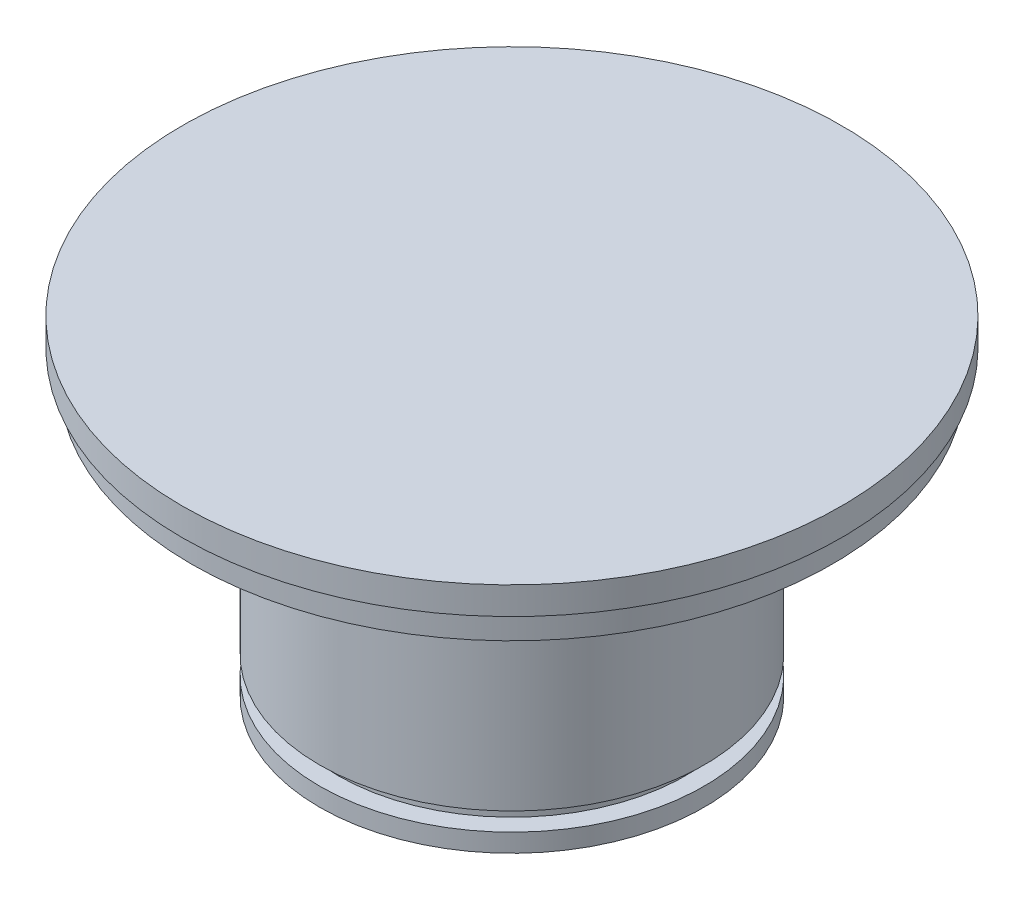
ISO-10303-21;
HEADER;
FILE_DESCRIPTION(('STEP AP214'),'2;1');
FILE_NAME('part.step','',(''),(''),'','','');
FILE_SCHEMA(('AUTOMOTIVE_DESIGN { 1 0 10303 214 1 1 1 1 }'));
ENDSEC;
DATA;
#1=APPLICATION_CONTEXT('core data for automotive mechanical design processes');
#2=APPLICATION_PROTOCOL_DEFINITION('international standard','automotive_design',2000,#1);
#3=PRODUCT_CONTEXT('',#1,'mechanical');
#4=PRODUCT('Part','Part','',(#3));
#5=PRODUCT_RELATED_PRODUCT_CATEGORY('part','',(#4));
#6=PRODUCT_DEFINITION_FORMATION('','',#4);
#7=PRODUCT_DEFINITION_CONTEXT('part definition',#1,'design');
#8=PRODUCT_DEFINITION('design','',#6,#7);
#9=PRODUCT_DEFINITION_SHAPE('','',#8);
#10=(LENGTH_UNIT() NAMED_UNIT(*) SI_UNIT(.MILLI.,.METRE.));
#11=(NAMED_UNIT(*) PLANE_ANGLE_UNIT() SI_UNIT($,.RADIAN.));
#12=(NAMED_UNIT(*) SI_UNIT($,.STERADIAN.) SOLID_ANGLE_UNIT());
#13=UNCERTAINTY_MEASURE_WITH_UNIT(LENGTH_MEASURE(1.E-05),#10,'distance_accuracy_value','');
#14=(GEOMETRIC_REPRESENTATION_CONTEXT(3) GLOBAL_UNCERTAINTY_ASSIGNED_CONTEXT((#13)) GLOBAL_UNIT_ASSIGNED_CONTEXT((#10,
#11,#12)) REPRESENTATION_CONTEXT('',''));
#15=CARTESIAN_POINT('',(0.,0.,0.));
#16=DIRECTION('',(0.,0.,1.));
#17=DIRECTION('',(1.,0.,0.));
#18=AXIS2_PLACEMENT_3D('',#15,#16,#17);
#19=CARTESIAN_POINT('',(0.,1.5,0.));
#20=DIRECTION('',(0.,-1.,0.));
#21=DIRECTION('',(0.,0.,-1.));
#22=AXIS2_PLACEMENT_3D('',#19,#20,#21);
#23=CYLINDRICAL_SURFACE('',#22,18.);
#24=CARTESIAN_POINT('',(0.,1.5,0.));
#25=DIRECTION('',(0.,1.,0.));
#26=DIRECTION('',(0.,0.,1.));
#27=AXIS2_PLACEMENT_3D('',#24,#25,#26);
#28=CIRCLE('',#27,18.);
#29=CARTESIAN_POINT('',(0.,1.5,18.));
#30=VERTEX_POINT('',#29);
#31=EDGE_CURVE('E70',#30,#30,#28,.T.);
#32=ORIENTED_EDGE('',*,*,#31,.F.);
#33=EDGE_LOOP('',(#32));
#34=FACE_BOUND('',#33,.T.);
#35=CARTESIAN_POINT('',(0.,0.,0.));
#36=DIRECTION('',(0.,1.,0.));
#37=DIRECTION('',(0.,0.,1.));
#38=AXIS2_PLACEMENT_3D('',#35,#36,#37);
#39=CIRCLE('',#38,18.);
#40=CARTESIAN_POINT('',(0.,0.,18.));
#41=VERTEX_POINT('',#40);
#42=EDGE_CURVE('E42',#41,#41,#39,.T.);
#43=ORIENTED_EDGE('',*,*,#42,.T.);
#44=EDGE_LOOP('',(#43));
#45=FACE_BOUND('',#44,.T.);
#46=ADVANCED_FACE('F39',(#34,#45),#23,.T.);
#47=CARTESIAN_POINT('',(0.,1.5,0.));
#48=DIRECTION('',(0.,1.,0.));
#49=DIRECTION('',(0.,0.,1.));
#50=AXIS2_PLACEMENT_3D('',#47,#48,#49);
#51=PLANE('',#50);
#52=ORIENTED_EDGE('',*,*,#31,.T.);
#53=EDGE_LOOP('',(#52));
#54=FACE_BOUND('',#53,.T.);
#55=ADVANCED_FACE('F81',(#54),#51,.T.);
#56=CARTESIAN_POINT('',(0.,0.,0.));
#57=DIRECTION('',(0.,1.,0.));
#58=DIRECTION('',(0.,0.,1.));
#59=AXIS2_PLACEMENT_3D('',#56,#57,#58);
#60=PLANE('',#59);
#61=CARTESIAN_POINT('',(0.,0.,0.));
#62=DIRECTION('',(0.,-1.,0.));
#63=DIRECTION('',(0.,0.,-1.));
#64=AXIS2_PLACEMENT_3D('',#61,#62,#63);
#65=CIRCLE('',#64,17.5);
#66=CARTESIAN_POINT('',(0.,0.,-17.5));
#67=VERTEX_POINT('',#66);
#68=EDGE_CURVE('E66',#67,#67,#65,.T.);
#69=ORIENTED_EDGE('',*,*,#68,.F.);
#70=EDGE_LOOP('',(#69));
#71=FACE_BOUND('',#70,.T.);
#72=ORIENTED_EDGE('',*,*,#42,.F.);
#73=EDGE_LOOP('',(#72));
#74=FACE_BOUND('',#73,.T.);
#75=ADVANCED_FACE('F78',(#71,#74),#60,.F.);
#76=CARTESIAN_POINT('',(0.,-1.5,0.));
#77=DIRECTION('',(0.,1.,0.));
#78=DIRECTION('',(0.,0.,1.));
#79=AXIS2_PLACEMENT_3D('',#76,#77,#78);
#80=CYLINDRICAL_SURFACE('',#79,17.5);
#81=CARTESIAN_POINT('',(0.,-1.5,0.));
#82=DIRECTION('',(0.,-1.,0.));
#83=DIRECTION('',(0.,0.,-1.));
#84=AXIS2_PLACEMENT_3D('',#81,#82,#83);
#85=CIRCLE('',#84,17.5);
#86=CARTESIAN_POINT('',(0.,-1.5,-17.5));
#87=VERTEX_POINT('',#86);
#88=EDGE_CURVE('E63',#87,#87,#85,.T.);
#89=ORIENTED_EDGE('',*,*,#88,.F.);
#90=EDGE_LOOP('',(#89));
#91=FACE_BOUND('',#90,.T.);
#92=ORIENTED_EDGE('',*,*,#68,.T.);
#93=EDGE_LOOP('',(#92));
#94=FACE_BOUND('',#93,.T.);
#95=ADVANCED_FACE('F80',(#91,#94),#80,.T.);
#96=CARTESIAN_POINT('',(0.,-1.5,0.));
#97=DIRECTION('',(0.,-1.,0.));
#98=DIRECTION('',(0.,0.,-1.));
#99=AXIS2_PLACEMENT_3D('',#96,#97,#98);
#100=PLANE('',#99);
#101=CARTESIAN_POINT('',(0.,-1.5,0.));
#102=DIRECTION('',(0.,-1.,0.));
#103=DIRECTION('',(0.,0.,-1.));
#104=AXIS2_PLACEMENT_3D('',#101,#102,#103);
#105=CIRCLE('',#104,12.);
#106=CARTESIAN_POINT('',(0.,-1.5,-12.));
#107=VERTEX_POINT('',#106);
#108=EDGE_CURVE('E51',#107,#107,#105,.T.);
#109=ORIENTED_EDGE('',*,*,#108,.F.);
#110=EDGE_LOOP('',(#109));
#111=FACE_BOUND('',#110,.T.);
#112=ORIENTED_EDGE('',*,*,#88,.T.);
#113=EDGE_LOOP('',(#112));
#114=FACE_BOUND('',#113,.T.);
#115=ADVANCED_FACE('F87',(#111,#114),#100,.T.);
#116=CARTESIAN_POINT('',(0.,-2.5,0.));
#117=DIRECTION('',(0.,1.,0.));
#118=DIRECTION('',(0.,0.,1.));
#119=AXIS2_PLACEMENT_3D('',#116,#117,#118);
#120=CYLINDRICAL_SURFACE('',#119,12.);
#121=CARTESIAN_POINT('',(0.,-2.5,0.));
#122=DIRECTION('',(0.,-1.,0.));
#123=DIRECTION('',(0.,0.,-1.));
#124=AXIS2_PLACEMENT_3D('',#121,#122,#123);
#125=CIRCLE('',#124,12.);
#126=CARTESIAN_POINT('',(0.,-2.5,-12.));
#127=VERTEX_POINT('',#126);
#128=EDGE_CURVE('E59',#127,#127,#125,.T.);
#129=ORIENTED_EDGE('',*,*,#128,.F.);
#130=EDGE_LOOP('',(#129));
#131=FACE_BOUND('',#130,.T.);
#132=ORIENTED_EDGE('',*,*,#108,.T.);
#133=EDGE_LOOP('',(#132));
#134=FACE_BOUND('',#133,.T.);
#135=ADVANCED_FACE('F122',(#131,#134),#120,.T.);
#136=CARTESIAN_POINT('',(0.,-2.5,0.));
#137=DIRECTION('',(0.,-1.,0.));
#138=DIRECTION('',(0.,0.,-1.));
#139=AXIS2_PLACEMENT_3D('',#136,#137,#138);
#140=PLANE('',#139);
#141=CARTESIAN_POINT('',(0.,-2.5,0.));
#142=DIRECTION('',(0.,-1.,0.));
#143=DIRECTION('',(0.,0.,-1.));
#144=AXIS2_PLACEMENT_3D('',#141,#142,#143);
#145=CIRCLE('',#144,10.5);
#146=CARTESIAN_POINT('',(0.,-2.5,-10.5));
#147=VERTEX_POINT('',#146);
#148=EDGE_CURVE('E46',#147,#147,#145,.T.);
#149=ORIENTED_EDGE('',*,*,#148,.F.);
#150=EDGE_LOOP('',(#149));
#151=FACE_BOUND('',#150,.T.);
#152=ORIENTED_EDGE('',*,*,#128,.T.);
#153=EDGE_LOOP('',(#152));
#154=FACE_BOUND('',#153,.T.);
#155=ADVANCED_FACE('F133',(#151,#154),#140,.T.);
#156=CARTESIAN_POINT('',(0.,-14.5,0.));
#157=DIRECTION('',(0.,1.,0.));
#158=DIRECTION('',(0.,0.,1.));
#159=AXIS2_PLACEMENT_3D('',#156,#157,#158);
#160=CYLINDRICAL_SURFACE('',#159,10.5);
#161=CARTESIAN_POINT('',(0.,-14.5,0.));
#162=DIRECTION('',(0.,-1.,0.));
#163=DIRECTION('',(0.,0.,-1.));
#164=AXIS2_PLACEMENT_3D('',#161,#162,#163);
#165=CIRCLE('',#164,10.5);
#166=CARTESIAN_POINT('',(0.,-14.5,-10.5));
#167=VERTEX_POINT('',#166);
#168=EDGE_CURVE('E57',#167,#167,#165,.T.);
#169=ORIENTED_EDGE('',*,*,#168,.F.);
#170=EDGE_LOOP('',(#169));
#171=FACE_BOUND('',#170,.T.);
#172=ORIENTED_EDGE('',*,*,#148,.T.);
#173=EDGE_LOOP('',(#172));
#174=FACE_BOUND('',#173,.T.);
#175=ADVANCED_FACE('F144',(#171,#174),#160,.T.);
#176=CARTESIAN_POINT('',(0.,-14.5,0.));
#177=DIRECTION('',(0.,-1.,0.));
#178=DIRECTION('',(0.,0.,-1.));
#179=AXIS2_PLACEMENT_3D('',#176,#177,#178);
#180=PLANE('',#179);
#181=CARTESIAN_POINT('',(0.,-14.5,0.));
#182=DIRECTION('',(0.,-1.,0.));
#183=DIRECTION('',(0.,0.,-1.));
#184=AXIS2_PLACEMENT_3D('',#181,#182,#183);
#185=CIRCLE('',#184,9.5);
#186=CARTESIAN_POINT('',(0.,-14.5,-9.5));
#187=VERTEX_POINT('',#186);
#188=EDGE_CURVE('E10',#187,#187,#185,.T.);
#189=ORIENTED_EDGE('',*,*,#188,.F.);
#190=EDGE_LOOP('',(#189));
#191=FACE_BOUND('',#190,.T.);
#192=ORIENTED_EDGE('',*,*,#168,.T.);
#193=EDGE_LOOP('',(#192));
#194=FACE_BOUND('',#193,.T.);
#195=ADVANCED_FACE('F155',(#191,#194),#180,.T.);
#196=CARTESIAN_POINT('',(0.,-15.5,0.));
#197=DIRECTION('',(0.,1.,0.));
#198=DIRECTION('',(0.,0.,1.));
#199=AXIS2_PLACEMENT_3D('',#196,#197,#198);
#200=CYLINDRICAL_SURFACE('',#199,9.5);
#201=CARTESIAN_POINT('',(0.,-15.5,0.));
#202=DIRECTION('',(0.,-1.,0.));
#203=DIRECTION('',(0.,0.,-1.));
#204=AXIS2_PLACEMENT_3D('',#201,#202,#203);
#205=CIRCLE('',#204,9.5);
#206=CARTESIAN_POINT('',(0.,-15.5,-9.5));
#207=VERTEX_POINT('',#206);
#208=EDGE_CURVE('E55',#207,#207,#205,.T.);
#209=ORIENTED_EDGE('',*,*,#208,.F.);
#210=EDGE_LOOP('',(#209));
#211=FACE_BOUND('',#210,.T.);
#212=ORIENTED_EDGE('',*,*,#188,.T.);
#213=EDGE_LOOP('',(#212));
#214=FACE_BOUND('',#213,.T.);
#215=ADVANCED_FACE('F166',(#211,#214),#200,.T.);
#216=CARTESIAN_POINT('',(0.,-16.5,0.));
#217=DIRECTION('',(0.,1.,0.));
#218=DIRECTION('',(0.,0.,1.));
#219=AXIS2_PLACEMENT_3D('',#216,#217,#218);
#220=CYLINDRICAL_SURFACE('',#219,10.5);
#221=CARTESIAN_POINT('',(0.,-16.5,0.));
#222=DIRECTION('',(0.,-1.,0.));
#223=DIRECTION('',(0.,0.,-1.));
#224=AXIS2_PLACEMENT_3D('',#221,#222,#223);
#225=CIRCLE('',#224,10.5);
#226=CARTESIAN_POINT('',(0.,-16.5,-10.5));
#227=VERTEX_POINT('',#226);
#228=EDGE_CURVE('E238',#227,#227,#225,.T.);
#229=ORIENTED_EDGE('',*,*,#228,.F.);
#230=EDGE_LOOP('',(#229));
#231=FACE_BOUND('',#230,.T.);
#232=CARTESIAN_POINT('',(0.,-15.5,0.));
#233=DIRECTION('',(0.,-1.,0.));
#234=DIRECTION('',(0.,0.,-1.));
#235=AXIS2_PLACEMENT_3D('',#232,#233,#234);
#236=CIRCLE('',#235,10.5);
#237=CARTESIAN_POINT('',(0.,-15.5,-10.5));
#238=VERTEX_POINT('',#237);
#239=EDGE_CURVE('E236',#238,#238,#236,.T.);
#240=ORIENTED_EDGE('',*,*,#239,.T.);
#241=EDGE_LOOP('',(#240));
#242=FACE_BOUND('',#241,.T.);
#243=ADVANCED_FACE('F177',(#231,#242),#220,.T.);
#244=CARTESIAN_POINT('',(0.,-16.5,0.));
#245=DIRECTION('',(0.,-1.,0.));
#246=DIRECTION('',(0.,0.,-1.));
#247=AXIS2_PLACEMENT_3D('',#244,#245,#246);
#248=PLANE('',#247);
#249=ORIENTED_EDGE('',*,*,#228,.T.);
#250=EDGE_LOOP('',(#249));
#251=FACE_BOUND('',#250,.T.);
#252=ADVANCED_FACE('F188',(#251),#248,.T.);
#253=CARTESIAN_POINT('',(0.,-15.5,0.));
#254=DIRECTION('',(0.,-1.,0.));
#255=DIRECTION('',(0.,0.,-1.));
#256=AXIS2_PLACEMENT_3D('',#253,#254,#255);
#257=PLANE('',#256);
#258=ORIENTED_EDGE('',*,*,#208,.T.);
#259=EDGE_LOOP('',(#258));
#260=FACE_BOUND('',#259,.T.);
#261=ORIENTED_EDGE('',*,*,#239,.F.);
#262=EDGE_LOOP('',(#261));
#263=FACE_BOUND('',#262,.T.);
#264=ADVANCED_FACE('F199',(#260,#263),#257,.F.);
#265=CLOSED_SHELL('',(#46,#55,#75,#95,#115,#135,#155,#175,#195,#215,#243,#252,#264));
#266=MANIFOLD_SOLID_BREP('B2',#265);
#267=ADVANCED_BREP_SHAPE_REPRESENTATION('',(#18,#266),#14);
#268=SHAPE_DEFINITION_REPRESENTATION(#9,#267);
ENDSEC;
END-ISO-10303-21;
